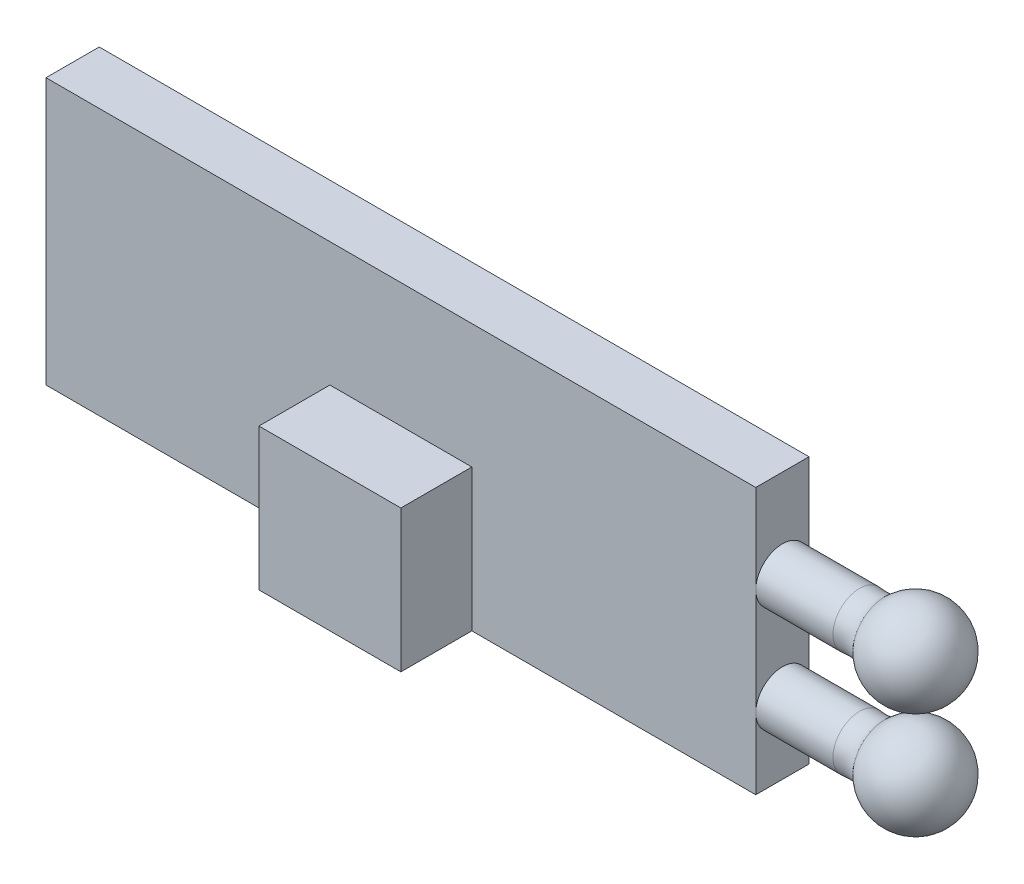
ISO-10303-21;
HEADER;
FILE_DESCRIPTION(('STEP AP214'),'2;1');
FILE_NAME('part.step','',(''),(''),'','','');
FILE_SCHEMA(('AUTOMOTIVE_DESIGN { 1 0 10303 214 1 1 1 1 }'));
ENDSEC;
DATA;
#1=APPLICATION_CONTEXT('core data for automotive mechanical design processes');
#2=APPLICATION_PROTOCOL_DEFINITION('international standard','automotive_design',2000,#1);
#3=PRODUCT_CONTEXT('',#1,'mechanical');
#4=PRODUCT('Part','Part','',(#3));
#5=PRODUCT_RELATED_PRODUCT_CATEGORY('part','',(#4));
#6=PRODUCT_DEFINITION_FORMATION('','',#4);
#7=PRODUCT_DEFINITION_CONTEXT('part definition',#1,'design');
#8=PRODUCT_DEFINITION('design','',#6,#7);
#9=PRODUCT_DEFINITION_SHAPE('','',#8);
#10=(LENGTH_UNIT() NAMED_UNIT(*) SI_UNIT(.MILLI.,.METRE.));
#11=(NAMED_UNIT(*) PLANE_ANGLE_UNIT() SI_UNIT($,.RADIAN.));
#12=(NAMED_UNIT(*) SI_UNIT($,.STERADIAN.) SOLID_ANGLE_UNIT());
#13=UNCERTAINTY_MEASURE_WITH_UNIT(LENGTH_MEASURE(1.E-05),#10,'distance_accuracy_value','');
#14=(GEOMETRIC_REPRESENTATION_CONTEXT(3) GLOBAL_UNCERTAINTY_ASSIGNED_CONTEXT((#13)) GLOBAL_UNIT_ASSIGNED_CONTEXT((#10,
#11,#12)) REPRESENTATION_CONTEXT('',''));
#15=CARTESIAN_POINT('',(0.,0.,0.));
#16=DIRECTION('',(0.,0.,1.));
#17=DIRECTION('',(1.,0.,0.));
#18=AXIS2_PLACEMENT_3D('',#15,#16,#17);
#19=CARTESIAN_POINT('',(47.5,10.,1.5));
#20=DIRECTION('',(-1.,0.,0.));
#21=DIRECTION('',(0.,1.,0.));
#22=AXIS2_PLACEMENT_3D('',#19,#20,#21);
#23=SPHERICAL_SURFACE('',#22,2.5);
#24=CARTESIAN_POINT('',(45.7968551321123,10.,1.5));
#25=DIRECTION('',(-1.,0.,0.));
#26=DIRECTION('',(0.,0.,1.));
#27=AXIS2_PLACEMENT_3D('',#24,#25,#26);
#28=CIRCLE('',#27,1.83010861945068);
#29=CARTESIAN_POINT('',(45.7968551321123,10.,3.33010861945068));
#30=VERTEX_POINT('',#29);
#31=EDGE_CURVE('E11',#30,#30,#28,.T.);
#32=ORIENTED_EDGE('',*,*,#31,.F.);
#33=EDGE_LOOP('',(#32));
#34=FACE_BOUND('',#33,.T.);
#35=ADVANCED_FACE('F44',(#34),#23,.T.);
#36=CARTESIAN_POINT('',(45.7968551321123,11.8301086194507,1.5));
#37=CARTESIAN_POINT('',(45.4823790373541,11.4042637237201,1.5));
#38=CARTESIAN_POINT('',(44.785241795498,11.4576764643071,1.5));
#39=CARTESIAN_POINT('',(44.3496242851529,11.5,1.5));
#40=B_SPLINE_CURVE_WITH_KNOTS('',3,(#36,#37,#38,#39),.UNSPECIFIED.,.F.,.F.,(4,4),(0.,1.),.UNSPECIFIED.);
#41=CARTESIAN_POINT('',(40.,10.,1.5));
#42=DIRECTION('',(-1.,0.,0.));
#43=AXIS1_PLACEMENT('',#41,#42);
#44=SURFACE_OF_REVOLUTION('',#40,#43);
#45=CARTESIAN_POINT('',(44.3496242851529,10.,1.5));
#46=DIRECTION('',(-1.,0.,0.));
#47=DIRECTION('',(0.,0.,1.));
#48=AXIS2_PLACEMENT_3D('',#45,#46,#47);
#49=CIRCLE('',#48,1.5);
#50=CARTESIAN_POINT('',(44.3496242851529,10.,3.));
#51=VERTEX_POINT('',#50);
#52=EDGE_CURVE('E50',#51,#51,#49,.T.);
#53=ORIENTED_EDGE('',*,*,#52,.F.);
#54=EDGE_LOOP('',(#53));
#55=FACE_BOUND('',#54,.T.);
#56=ORIENTED_EDGE('',*,*,#31,.T.);
#57=EDGE_LOOP('',(#56));
#58=FACE_BOUND('',#57,.T.);
#59=ADVANCED_FACE('F66',(#55,#58),#44,.T.);
#60=CARTESIAN_POINT('',(40.,10.,1.5));
#61=DIRECTION('',(-1.,0.,0.));
#62=DIRECTION('',(0.,0.,1.));
#63=AXIS2_PLACEMENT_3D('',#60,#61,#62);
#64=CYLINDRICAL_SURFACE('',#63,1.5);
#65=CARTESIAN_POINT('',(40.,10.,1.5));
#66=DIRECTION('',(-1.,0.,0.));
#67=DIRECTION('',(0.,0.,1.));
#68=AXIS2_PLACEMENT_3D('',#65,#66,#67);
#69=CIRCLE('',#68,1.5);
#70=CARTESIAN_POINT('',(40.,10.,3.));
#71=VERTEX_POINT('',#70);
#72=EDGE_CURVE('E54',#71,#71,#69,.T.);
#73=ORIENTED_EDGE('',*,*,#72,.F.);
#74=EDGE_LOOP('',(#73));
#75=FACE_BOUND('',#74,.T.);
#76=ORIENTED_EDGE('',*,*,#52,.T.);
#77=EDGE_LOOP('',(#76));
#78=FACE_BOUND('',#77,.T.);
#79=ADVANCED_FACE('F69',(#75,#78),#64,.T.);
#80=CARTESIAN_POINT('',(40.,11.5,1.5));
#81=DIRECTION('',(1.,0.,0.));
#82=DIRECTION('',(0.,0.,-1.));
#83=AXIS2_PLACEMENT_3D('',#80,#81,#82);
#84=PLANE('',#83);
#85=ORIENTED_EDGE('',*,*,#72,.T.);
#86=EDGE_LOOP('',(#85));
#87=FACE_BOUND('',#86,.T.);
#88=ADVANCED_FACE('F73',(#87),#84,.F.);
#89=CLOSED_SHELL('',(#35,#59,#79,#88));
#90=MANIFOLD_SOLID_BREP('B2',#89);
#91=CARTESIAN_POINT('',(47.5,4.,1.5));
#92=DIRECTION('',(-1.,0.,0.));
#93=DIRECTION('',(0.,1.,0.));
#94=AXIS2_PLACEMENT_3D('',#91,#92,#93);
#95=SPHERICAL_SURFACE('',#94,2.5);
#96=CARTESIAN_POINT('',(45.7968551321123,4.,1.5));
#97=DIRECTION('',(-1.,0.,0.));
#98=DIRECTION('',(0.,0.,1.));
#99=AXIS2_PLACEMENT_3D('',#96,#97,#98);
#100=CIRCLE('',#99,1.83010861945068);
#101=CARTESIAN_POINT('',(45.7968551321123,4.,3.33010861945068));
#102=VERTEX_POINT('',#101);
#103=EDGE_CURVE('E43',#102,#102,#100,.T.);
#104=ORIENTED_EDGE('',*,*,#103,.F.);
#105=EDGE_LOOP('',(#104));
#106=FACE_BOUND('',#105,.T.);
#107=ADVANCED_FACE('F117',(#106),#95,.T.);
#108=CARTESIAN_POINT('',(45.7968551321123,5.83010861945068,1.5));
#109=CARTESIAN_POINT('',(45.4823790373541,5.40426372372013,1.5));
#110=CARTESIAN_POINT('',(44.785241795498,5.45767646430715,1.5));
#111=CARTESIAN_POINT('',(44.3496242851529,5.5,1.5));
#112=B_SPLINE_CURVE_WITH_KNOTS('',3,(#108,#109,#110,#111),.UNSPECIFIED.,.F.,.F.,(4,4),(0.,1.),.UNSPECIFIED.);
#113=CARTESIAN_POINT('',(40.,4.,1.5));
#114=DIRECTION('',(-1.,0.,0.));
#115=AXIS1_PLACEMENT('',#113,#114);
#116=SURFACE_OF_REVOLUTION('',#112,#115);
#117=CARTESIAN_POINT('',(44.3496242851529,4.,1.5));
#118=DIRECTION('',(-1.,0.,0.));
#119=DIRECTION('',(0.,0.,1.));
#120=AXIS2_PLACEMENT_3D('',#117,#118,#119);
#121=CIRCLE('',#120,1.5);
#122=CARTESIAN_POINT('',(44.3496242851529,4.,3.));
#123=VERTEX_POINT('',#122);
#124=EDGE_CURVE('E123',#123,#123,#121,.T.);
#125=ORIENTED_EDGE('',*,*,#124,.F.);
#126=EDGE_LOOP('',(#125));
#127=FACE_BOUND('',#126,.T.);
#128=ORIENTED_EDGE('',*,*,#103,.T.);
#129=EDGE_LOOP('',(#128));
#130=FACE_BOUND('',#129,.T.);
#131=ADVANCED_FACE('F139',(#127,#130),#116,.T.);
#132=CARTESIAN_POINT('',(40.,4.,1.5));
#133=DIRECTION('',(-1.,0.,0.));
#134=DIRECTION('',(0.,0.,1.));
#135=AXIS2_PLACEMENT_3D('',#132,#133,#134);
#136=CYLINDRICAL_SURFACE('',#135,1.5);
#137=CARTESIAN_POINT('',(40.,4.,1.5));
#138=DIRECTION('',(-1.,0.,0.));
#139=DIRECTION('',(0.,0.,1.));
#140=AXIS2_PLACEMENT_3D('',#137,#138,#139);
#141=CIRCLE('',#140,1.5);
#142=CARTESIAN_POINT('',(40.,4.,3.));
#143=VERTEX_POINT('',#142);
#144=EDGE_CURVE('E127',#143,#143,#141,.T.);
#145=ORIENTED_EDGE('',*,*,#144,.F.);
#146=EDGE_LOOP('',(#145));
#147=FACE_BOUND('',#146,.T.);
#148=ORIENTED_EDGE('',*,*,#124,.T.);
#149=EDGE_LOOP('',(#148));
#150=FACE_BOUND('',#149,.T.);
#151=ADVANCED_FACE('F142',(#147,#150),#136,.T.);
#152=CARTESIAN_POINT('',(40.,5.5,1.5));
#153=DIRECTION('',(1.,0.,0.));
#154=DIRECTION('',(0.,0.,-1.));
#155=AXIS2_PLACEMENT_3D('',#152,#153,#154);
#156=PLANE('',#155);
#157=ORIENTED_EDGE('',*,*,#144,.T.);
#158=EDGE_LOOP('',(#157));
#159=FACE_BOUND('',#158,.T.);
#160=ADVANCED_FACE('F146',(#159),#156,.F.);
#161=CLOSED_SHELL('',(#107,#131,#151,#160));
#162=MANIFOLD_SOLID_BREP('B6',#161);
#163=CARTESIAN_POINT('',(16.,8.,7.));
#164=DIRECTION('',(1.,0.,0.));
#165=DIRECTION('',(0.,0.,-1.));
#166=AXIS2_PLACEMENT_3D('',#163,#164,#165);
#167=PLANE('',#166);
#168=DIRECTION('',(0.,-1.,0.));
#169=VECTOR('',#168,1.);
#170=CARTESIAN_POINT('',(16.,8.,3.));
#171=LINE('',#170,#169);
#172=CARTESIAN_POINT('',(16.,8.,3.));
#173=VERTEX_POINT('',#172);
#174=CARTESIAN_POINT('',(16.,0.,3.));
#175=VERTEX_POINT('',#174);
#176=EDGE_CURVE('E251',#173,#175,#171,.T.);
#177=ORIENTED_EDGE('',*,*,#176,.T.);
#178=DIRECTION('',(0.,0.,-1.));
#179=VECTOR('',#178,1.);
#180=CARTESIAN_POINT('',(16.,0.,7.));
#181=LINE('',#180,#179);
#182=CARTESIAN_POINT('',(16.,0.,7.));
#183=VERTEX_POINT('',#182);
#184=EDGE_CURVE('E115',#183,#175,#181,.T.);
#185=ORIENTED_EDGE('',*,*,#184,.F.);
#186=DIRECTION('',(0.,-1.,0.));
#187=VECTOR('',#186,1.);
#188=CARTESIAN_POINT('',(16.,8.,7.));
#189=LINE('',#188,#187);
#190=CARTESIAN_POINT('',(16.,8.,7.));
#191=VERTEX_POINT('',#190);
#192=EDGE_CURVE('E239',#191,#183,#189,.T.);
#193=ORIENTED_EDGE('',*,*,#192,.F.);
#194=DIRECTION('',(0.,0.,-1.));
#195=VECTOR('',#194,1.);
#196=CARTESIAN_POINT('',(16.,8.,7.));
#197=LINE('',#196,#195);
#198=EDGE_CURVE('E247',#191,#173,#197,.T.);
#199=ORIENTED_EDGE('',*,*,#198,.T.);
#200=EDGE_LOOP('',(#177,#185,#193,#199));
#201=FACE_BOUND('',#200,.T.);
#202=ADVANCED_FACE('F188',(#201),#167,.F.);
#203=CARTESIAN_POINT('',(16.,0.,7.));
#204=DIRECTION('',(0.,1.,0.));
#205=DIRECTION('',(0.,0.,1.));
#206=AXIS2_PLACEMENT_3D('',#203,#204,#205);
#207=PLANE('',#206);
#208=DIRECTION('',(1.,0.,0.));
#209=VECTOR('',#208,1.);
#210=CARTESIAN_POINT('',(16.,0.,3.));
#211=LINE('',#210,#209);
#212=CARTESIAN_POINT('',(24.,0.,3.));
#213=VERTEX_POINT('',#212);
#214=EDGE_CURVE('E243',#175,#213,#211,.T.);
#215=ORIENTED_EDGE('',*,*,#214,.T.);
#216=DIRECTION('',(0.,0.,-1.));
#217=VECTOR('',#216,1.);
#218=CARTESIAN_POINT('',(24.,0.,7.));
#219=LINE('',#218,#217);
#220=CARTESIAN_POINT('',(24.,0.,7.));
#221=VERTEX_POINT('',#220);
#222=EDGE_CURVE('E196',#221,#213,#219,.T.);
#223=ORIENTED_EDGE('',*,*,#222,.F.);
#224=DIRECTION('',(1.,0.,0.));
#225=VECTOR('',#224,1.);
#226=CARTESIAN_POINT('',(16.,0.,7.));
#227=LINE('',#226,#225);
#228=EDGE_CURVE('E234',#183,#221,#227,.T.);
#229=ORIENTED_EDGE('',*,*,#228,.F.);
#230=ORIENTED_EDGE('',*,*,#184,.T.);
#231=EDGE_LOOP('',(#215,#223,#229,#230));
#232=FACE_BOUND('',#231,.T.);
#233=ADVANCED_FACE('F242',(#232),#207,.F.);
#234=CARTESIAN_POINT('',(24.,8.,7.));
#235=DIRECTION('',(-1.,0.,0.));
#236=DIRECTION('',(0.,0.,1.));
#237=AXIS2_PLACEMENT_3D('',#234,#235,#236);
#238=PLANE('',#237);
#239=DIRECTION('',(0.,1.,0.));
#240=VECTOR('',#239,1.);
#241=CARTESIAN_POINT('',(24.,8.,3.));
#242=LINE('',#241,#240);
#243=CARTESIAN_POINT('',(24.,8.,3.));
#244=VERTEX_POINT('',#243);
#245=EDGE_CURVE('E221',#213,#244,#242,.T.);
#246=ORIENTED_EDGE('',*,*,#245,.T.);
#247=DIRECTION('',(0.,0.,-1.));
#248=VECTOR('',#247,1.);
#249=CARTESIAN_POINT('',(24.,8.,7.));
#250=LINE('',#249,#248);
#251=CARTESIAN_POINT('',(24.,8.,7.));
#252=VERTEX_POINT('',#251);
#253=EDGE_CURVE('E244',#252,#244,#250,.T.);
#254=ORIENTED_EDGE('',*,*,#253,.F.);
#255=DIRECTION('',(0.,1.,0.));
#256=VECTOR('',#255,1.);
#257=CARTESIAN_POINT('',(24.,8.,7.));
#258=LINE('',#257,#256);
#259=EDGE_CURVE('E237',#221,#252,#258,.T.);
#260=ORIENTED_EDGE('',*,*,#259,.F.);
#261=ORIENTED_EDGE('',*,*,#222,.T.);
#262=EDGE_LOOP('',(#246,#254,#260,#261));
#263=FACE_BOUND('',#262,.T.);
#264=ADVANCED_FACE('F245',(#263),#238,.F.);
#265=CARTESIAN_POINT('',(16.,8.,7.));
#266=DIRECTION('',(0.,-1.,0.));
#267=DIRECTION('',(0.,0.,-1.));
#268=AXIS2_PLACEMENT_3D('',#265,#266,#267);
#269=PLANE('',#268);
#270=DIRECTION('',(-1.,0.,0.));
#271=VECTOR('',#270,1.);
#272=CARTESIAN_POINT('',(16.,8.,3.));
#273=LINE('',#272,#271);
#274=EDGE_CURVE('E227',#244,#173,#273,.T.);
#275=ORIENTED_EDGE('',*,*,#274,.T.);
#276=ORIENTED_EDGE('',*,*,#198,.F.);
#277=DIRECTION('',(-1.,0.,0.));
#278=VECTOR('',#277,1.);
#279=CARTESIAN_POINT('',(16.,8.,7.));
#280=LINE('',#279,#278);
#281=EDGE_CURVE('E204',#252,#191,#280,.T.);
#282=ORIENTED_EDGE('',*,*,#281,.F.);
#283=ORIENTED_EDGE('',*,*,#253,.T.);
#284=EDGE_LOOP('',(#275,#276,#282,#283));
#285=FACE_BOUND('',#284,.T.);
#286=ADVANCED_FACE('F258',(#285),#269,.F.);
#287=CARTESIAN_POINT('',(0.,0.,7.));
#288=DIRECTION('',(0.,0.,1.));
#289=DIRECTION('',(1.,0.,0.));
#290=AXIS2_PLACEMENT_3D('',#287,#288,#289);
#291=PLANE('',#290);
#292=ORIENTED_EDGE('',*,*,#192,.T.);
#293=ORIENTED_EDGE('',*,*,#228,.T.);
#294=ORIENTED_EDGE('',*,*,#259,.T.);
#295=ORIENTED_EDGE('',*,*,#281,.T.);
#296=EDGE_LOOP('',(#292,#293,#294,#295));
#297=FACE_BOUND('',#296,.T.);
#298=ADVANCED_FACE('F235',(#297),#291,.T.);
#299=CARTESIAN_POINT('',(0.,0.,3.));
#300=DIRECTION('',(0.,0.,1.));
#301=DIRECTION('',(1.,0.,0.));
#302=AXIS2_PLACEMENT_3D('',#299,#300,#301);
#303=PLANE('',#302);
#304=ORIENTED_EDGE('',*,*,#176,.F.);
#305=ORIENTED_EDGE('',*,*,#274,.F.);
#306=ORIENTED_EDGE('',*,*,#245,.F.);
#307=ORIENTED_EDGE('',*,*,#214,.F.);
#308=EDGE_LOOP('',(#304,#305,#306,#307));
#309=FACE_BOUND('',#308,.T.);
#310=ADVANCED_FACE('F261',(#309),#303,.F.);
#311=CLOSED_SHELL('',(#202,#233,#264,#286,#298,#310));
#312=MANIFOLD_SOLID_BREP('B38',#311);
#313=CARTESIAN_POINT('',(0.,0.,3.));
#314=DIRECTION('',(1.,0.,0.));
#315=DIRECTION('',(0.,0.,-1.));
#316=AXIS2_PLACEMENT_3D('',#313,#314,#315);
#317=PLANE('',#316);
#318=DIRECTION('',(0.,-1.,0.));
#319=VECTOR('',#318,1.);
#320=CARTESIAN_POINT('',(0.,0.,0.));
#321=LINE('',#320,#319);
#322=CARTESIAN_POINT('',(0.,15.,0.));
#323=VERTEX_POINT('',#322);
#324=CARTESIAN_POINT('',(0.,0.,0.));
#325=VERTEX_POINT('',#324);
#326=EDGE_CURVE('E374',#323,#325,#321,.T.);
#327=ORIENTED_EDGE('',*,*,#326,.T.);
#328=DIRECTION('',(0.,0.,-1.));
#329=VECTOR('',#328,1.);
#330=CARTESIAN_POINT('',(0.,0.,3.));
#331=LINE('',#330,#329);
#332=CARTESIAN_POINT('',(0.,0.,3.));
#333=VERTEX_POINT('',#332);
#334=EDGE_CURVE('E186',#333,#325,#331,.T.);
#335=ORIENTED_EDGE('',*,*,#334,.F.);
#336=DIRECTION('',(0.,-1.,0.));
#337=VECTOR('',#336,1.);
#338=CARTESIAN_POINT('',(0.,0.,3.));
#339=LINE('',#338,#337);
#340=CARTESIAN_POINT('',(0.,15.,3.));
#341=VERTEX_POINT('',#340);
#342=EDGE_CURVE('E362',#341,#333,#339,.T.);
#343=ORIENTED_EDGE('',*,*,#342,.F.);
#344=DIRECTION('',(0.,0.,-1.));
#345=VECTOR('',#344,1.);
#346=CARTESIAN_POINT('',(0.,15.,3.));
#347=LINE('',#346,#345);
#348=EDGE_CURVE('E370',#341,#323,#347,.T.);
#349=ORIENTED_EDGE('',*,*,#348,.T.);
#350=EDGE_LOOP('',(#327,#335,#343,#349));
#351=FACE_BOUND('',#350,.T.);
#352=ADVANCED_FACE('F311',(#351),#317,.F.);
#353=CARTESIAN_POINT('',(0.,0.,3.));
#354=DIRECTION('',(0.,1.,0.));
#355=DIRECTION('',(0.,0.,1.));
#356=AXIS2_PLACEMENT_3D('',#353,#354,#355);
#357=PLANE('',#356);
#358=DIRECTION('',(1.,0.,0.));
#359=VECTOR('',#358,1.);
#360=CARTESIAN_POINT('',(0.,0.,0.));
#361=LINE('',#360,#359);
#362=CARTESIAN_POINT('',(40.,0.,0.));
#363=VERTEX_POINT('',#362);
#364=EDGE_CURVE('E366',#325,#363,#361,.T.);
#365=ORIENTED_EDGE('',*,*,#364,.T.);
#366=DIRECTION('',(0.,0.,-1.));
#367=VECTOR('',#366,1.);
#368=CARTESIAN_POINT('',(40.,0.,3.));
#369=LINE('',#368,#367);
#370=CARTESIAN_POINT('',(40.,0.,3.));
#371=VERTEX_POINT('',#370);
#372=EDGE_CURVE('E319',#371,#363,#369,.T.);
#373=ORIENTED_EDGE('',*,*,#372,.F.);
#374=DIRECTION('',(1.,0.,0.));
#375=VECTOR('',#374,1.);
#376=CARTESIAN_POINT('',(0.,0.,3.));
#377=LINE('',#376,#375);
#378=EDGE_CURVE('E357',#333,#371,#377,.T.);
#379=ORIENTED_EDGE('',*,*,#378,.F.);
#380=ORIENTED_EDGE('',*,*,#334,.T.);
#381=EDGE_LOOP('',(#365,#373,#379,#380));
#382=FACE_BOUND('',#381,.T.);
#383=ADVANCED_FACE('F365',(#382),#357,.F.);
#384=CARTESIAN_POINT('',(40.,0.,3.));
#385=DIRECTION('',(-1.,0.,0.));
#386=DIRECTION('',(0.,0.,1.));
#387=AXIS2_PLACEMENT_3D('',#384,#385,#386);
#388=PLANE('',#387);
#389=DIRECTION('',(0.,1.,0.));
#390=VECTOR('',#389,1.);
#391=CARTESIAN_POINT('',(40.,0.,0.));
#392=LINE('',#391,#390);
#393=CARTESIAN_POINT('',(40.,15.,0.));
#394=VERTEX_POINT('',#393);
#395=EDGE_CURVE('E344',#363,#394,#392,.T.);
#396=ORIENTED_EDGE('',*,*,#395,.T.);
#397=DIRECTION('',(0.,0.,-1.));
#398=VECTOR('',#397,1.);
#399=CARTESIAN_POINT('',(40.,15.,3.));
#400=LINE('',#399,#398);
#401=CARTESIAN_POINT('',(40.,15.,3.));
#402=VERTEX_POINT('',#401);
#403=EDGE_CURVE('E367',#402,#394,#400,.T.);
#404=ORIENTED_EDGE('',*,*,#403,.F.);
#405=DIRECTION('',(0.,1.,0.));
#406=VECTOR('',#405,1.);
#407=CARTESIAN_POINT('',(40.,0.,3.));
#408=LINE('',#407,#406);
#409=EDGE_CURVE('E360',#371,#402,#408,.T.);
#410=ORIENTED_EDGE('',*,*,#409,.F.);
#411=ORIENTED_EDGE('',*,*,#372,.T.);
#412=EDGE_LOOP('',(#396,#404,#410,#411));
#413=FACE_BOUND('',#412,.T.);
#414=ADVANCED_FACE('F368',(#413),#388,.F.);
#415=CARTESIAN_POINT('',(0.,15.,3.));
#416=DIRECTION('',(0.,-1.,0.));
#417=DIRECTION('',(0.,0.,-1.));
#418=AXIS2_PLACEMENT_3D('',#415,#416,#417);
#419=PLANE('',#418);
#420=DIRECTION('',(-1.,0.,0.));
#421=VECTOR('',#420,1.);
#422=CARTESIAN_POINT('',(0.,15.,0.));
#423=LINE('',#422,#421);
#424=EDGE_CURVE('E350',#394,#323,#423,.T.);
#425=ORIENTED_EDGE('',*,*,#424,.T.);
#426=ORIENTED_EDGE('',*,*,#348,.F.);
#427=DIRECTION('',(-1.,0.,0.));
#428=VECTOR('',#427,1.);
#429=CARTESIAN_POINT('',(0.,15.,3.));
#430=LINE('',#429,#428);
#431=EDGE_CURVE('E327',#402,#341,#430,.T.);
#432=ORIENTED_EDGE('',*,*,#431,.F.);
#433=ORIENTED_EDGE('',*,*,#403,.T.);
#434=EDGE_LOOP('',(#425,#426,#432,#433));
#435=FACE_BOUND('',#434,.T.);
#436=ADVANCED_FACE('F381',(#435),#419,.F.);
#437=CARTESIAN_POINT('',(0.,0.,3.));
#438=DIRECTION('',(0.,0.,-1.));
#439=DIRECTION('',(-1.,0.,0.));
#440=AXIS2_PLACEMENT_3D('',#437,#438,#439);
#441=PLANE('',#440);
#442=ORIENTED_EDGE('',*,*,#342,.T.);
#443=ORIENTED_EDGE('',*,*,#378,.T.);
#444=ORIENTED_EDGE('',*,*,#409,.T.);
#445=ORIENTED_EDGE('',*,*,#431,.T.);
#446=EDGE_LOOP('',(#442,#443,#444,#445));
#447=FACE_BOUND('',#446,.T.);
#448=ADVANCED_FACE('F358',(#447),#441,.F.);
#449=CARTESIAN_POINT('',(0.,0.,0.));
#450=DIRECTION('',(0.,0.,-1.));
#451=DIRECTION('',(-1.,0.,0.));
#452=AXIS2_PLACEMENT_3D('',#449,#450,#451);
#453=PLANE('',#452);
#454=ORIENTED_EDGE('',*,*,#326,.F.);
#455=ORIENTED_EDGE('',*,*,#424,.F.);
#456=ORIENTED_EDGE('',*,*,#395,.F.);
#457=ORIENTED_EDGE('',*,*,#364,.F.);
#458=EDGE_LOOP('',(#454,#455,#456,#457));
#459=FACE_BOUND('',#458,.T.);
#460=ADVANCED_FACE('F384',(#459),#453,.T.);
#461=CLOSED_SHELL('',(#352,#383,#414,#436,#448,#460));
#462=MANIFOLD_SOLID_BREP('B109',#461);
#463=ADVANCED_BREP_SHAPE_REPRESENTATION('',(#18,#90,#162,#312,#462),#14);
#464=SHAPE_DEFINITION_REPRESENTATION(#9,#463);
ENDSEC;
END-ISO-10303-21;
